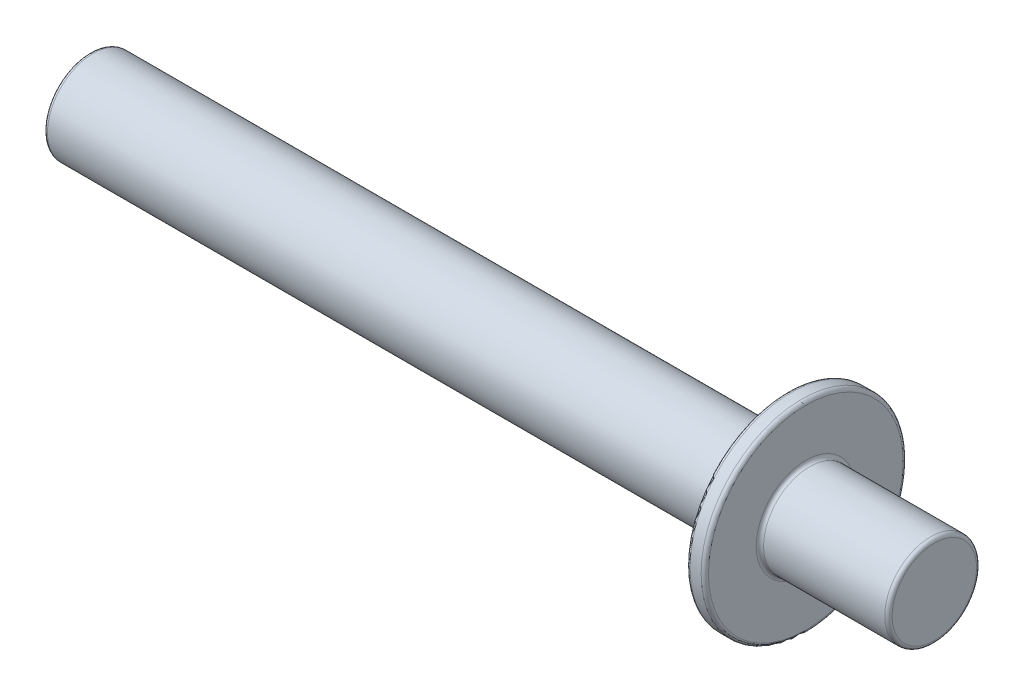
ISO-10303-21;
HEADER;
FILE_DESCRIPTION(('STEP AP214'),'2;1');
FILE_NAME('part.step','',(''),(''),'','','');
FILE_SCHEMA(('AUTOMOTIVE_DESIGN { 1 0 10303 214 1 1 1 1 }'));
ENDSEC;
DATA;
#1=APPLICATION_CONTEXT('core data for automotive mechanical design processes');
#2=APPLICATION_PROTOCOL_DEFINITION('international standard','automotive_design',2000,#1);
#3=PRODUCT_CONTEXT('',#1,'mechanical');
#4=PRODUCT('Part','Part','',(#3));
#5=PRODUCT_RELATED_PRODUCT_CATEGORY('part','',(#4));
#6=PRODUCT_DEFINITION_FORMATION('','',#4);
#7=PRODUCT_DEFINITION_CONTEXT('part definition',#1,'design');
#8=PRODUCT_DEFINITION('design','',#6,#7);
#9=PRODUCT_DEFINITION_SHAPE('','',#8);
#10=(LENGTH_UNIT() NAMED_UNIT(*) SI_UNIT(.MILLI.,.METRE.));
#11=(NAMED_UNIT(*) PLANE_ANGLE_UNIT() SI_UNIT($,.RADIAN.));
#12=(NAMED_UNIT(*) SI_UNIT($,.STERADIAN.) SOLID_ANGLE_UNIT());
#13=UNCERTAINTY_MEASURE_WITH_UNIT(LENGTH_MEASURE(1.E-05),#10,'distance_accuracy_value','');
#14=(GEOMETRIC_REPRESENTATION_CONTEXT(3) GLOBAL_UNCERTAINTY_ASSIGNED_CONTEXT((#13)) GLOBAL_UNIT_ASSIGNED_CONTEXT((#10,
#11,#12)) REPRESENTATION_CONTEXT('',''));
#15=CARTESIAN_POINT('',(0.,0.,0.));
#16=DIRECTION('',(0.,0.,1.));
#17=DIRECTION('',(1.,0.,0.));
#18=AXIS2_PLACEMENT_3D('',#15,#16,#17);
#19=CARTESIAN_POINT('',(-46.,0.,0.));
#20=DIRECTION('',(1.,0.,0.));
#21=DIRECTION('',(0.,0.,-1.));
#22=AXIS2_PLACEMENT_3D('',#19,#20,#21);
#23=PLANE('',#22);
#24=CARTESIAN_POINT('',(-46.,0.,0.));
#25=DIRECTION('',(1.,0.,0.));
#26=DIRECTION('',(0.,0.,-1.));
#27=AXIS2_PLACEMENT_3D('',#24,#25,#26);
#28=CIRCLE('',#27,2.3);
#29=CARTESIAN_POINT('',(-46.,0.,-2.3));
#30=VERTEX_POINT('',#29);
#31=EDGE_CURVE('E10',#30,#30,#28,.F.);
#32=ORIENTED_EDGE('',*,*,#31,.T.);
#33=EDGE_LOOP('',(#32));
#34=FACE_BOUND('',#33,.T.);
#35=ADVANCED_FACE('F31',(#34),#23,.F.);
#36=CARTESIAN_POINT('',(-86.0867088607595,0.,0.));
#37=DIRECTION('',(-1.,0.,0.));
#38=DIRECTION('',(0.,0.,1.));
#39=AXIS2_PLACEMENT_3D('',#36,#37,#38);
#40=CYLINDRICAL_SURFACE('',#39,2.5);
#41=CARTESIAN_POINT('',(-8.20000000000001,0.,0.));
#42=DIRECTION('',(1.,0.,0.));
#43=DIRECTION('',(0.,0.,-1.));
#44=AXIS2_PLACEMENT_3D('',#41,#42,#43);
#45=CIRCLE('',#44,2.5);
#46=CARTESIAN_POINT('',(-8.20000000000001,0.,-2.5));
#47=VERTEX_POINT('',#46);
#48=EDGE_CURVE('E37',#47,#47,#45,.F.);
#49=ORIENTED_EDGE('',*,*,#48,.T.);
#50=EDGE_LOOP('',(#49));
#51=FACE_BOUND('',#50,.T.);
#52=CARTESIAN_POINT('',(-45.8,0.,0.));
#53=DIRECTION('',(1.,0.,0.));
#54=DIRECTION('',(0.,0.,-1.));
#55=AXIS2_PLACEMENT_3D('',#52,#53,#54);
#56=CIRCLE('',#55,2.5);
#57=CARTESIAN_POINT('',(-45.8,0.,-2.5));
#58=VERTEX_POINT('',#57);
#59=EDGE_CURVE('E41',#58,#58,#56,.T.);
#60=ORIENTED_EDGE('',*,*,#59,.T.);
#61=EDGE_LOOP('',(#60));
#62=FACE_BOUND('',#61,.T.);
#63=ADVANCED_FACE('F88',(#51,#62),#40,.T.);
#64=CARTESIAN_POINT('',(-8.00000000000001,2.5,0.));
#65=DIRECTION('',(1.,0.,0.));
#66=DIRECTION('',(0.,0.,-1.));
#67=AXIS2_PLACEMENT_3D('',#64,#65,#66);
#68=PLANE('',#67);
#69=CARTESIAN_POINT('',(-8.00000000000001,0.,0.));
#70=DIRECTION('',(1.,0.,0.));
#71=DIRECTION('',(0.,0.,-1.));
#72=AXIS2_PLACEMENT_3D('',#69,#70,#71);
#73=CIRCLE('',#72,5.3);
#74=CARTESIAN_POINT('',(-8.00000000000001,0.,-5.3));
#75=VERTEX_POINT('',#74);
#76=EDGE_CURVE('E56',#75,#75,#73,.F.);
#77=ORIENTED_EDGE('',*,*,#76,.T.);
#78=EDGE_LOOP('',(#77));
#79=FACE_BOUND('',#78,.T.);
#80=CARTESIAN_POINT('',(-8.00000000000001,0.,0.));
#81=DIRECTION('',(1.,0.,0.));
#82=DIRECTION('',(0.,0.,-1.));
#83=AXIS2_PLACEMENT_3D('',#80,#81,#82);
#84=CIRCLE('',#83,2.7);
#85=CARTESIAN_POINT('',(-8.00000000000001,0.,-2.7));
#86=VERTEX_POINT('',#85);
#87=EDGE_CURVE('E59',#86,#86,#84,.T.);
#88=ORIENTED_EDGE('',*,*,#87,.T.);
#89=EDGE_LOOP('',(#88));
#90=FACE_BOUND('',#89,.T.);
#91=ADVANCED_FACE('F85',(#79,#90),#68,.F.);
#92=CARTESIAN_POINT('',(-86.0867088607595,0.,0.));
#93=DIRECTION('',(-1.,0.,0.));
#94=DIRECTION('',(0.,0.,1.));
#95=AXIS2_PLACEMENT_3D('',#92,#93,#94);
#96=CYLINDRICAL_SURFACE('',#95,5.5);
#97=CARTESIAN_POINT('',(-7.2,0.,0.));
#98=DIRECTION('',(-1.,0.,0.));
#99=DIRECTION('',(0.,0.,1.));
#100=AXIS2_PLACEMENT_3D('',#97,#98,#99);
#101=CIRCLE('',#100,5.5);
#102=CARTESIAN_POINT('',(-7.2,0.,5.5));
#103=VERTEX_POINT('',#102);
#104=EDGE_CURVE('E68',#103,#103,#101,.T.);
#105=ORIENTED_EDGE('',*,*,#104,.T.);
#106=EDGE_LOOP('',(#105));
#107=FACE_BOUND('',#106,.T.);
#108=CARTESIAN_POINT('',(-7.8,0.,0.));
#109=DIRECTION('',(1.,0.,0.));
#110=DIRECTION('',(0.,0.,-1.));
#111=AXIS2_PLACEMENT_3D('',#108,#109,#110);
#112=CIRCLE('',#111,5.5);
#113=CARTESIAN_POINT('',(-7.8,0.,-5.5));
#114=VERTEX_POINT('',#113);
#115=EDGE_CURVE('E71',#114,#114,#112,.T.);
#116=ORIENTED_EDGE('',*,*,#115,.T.);
#117=EDGE_LOOP('',(#116));
#118=FACE_BOUND('',#117,.T.);
#119=ADVANCED_FACE('F75',(#107,#118),#96,.T.);
#120=CARTESIAN_POINT('',(-7.,5.5,0.));
#121=DIRECTION('',(-1.,0.,0.));
#122=DIRECTION('',(0.,0.,1.));
#123=AXIS2_PLACEMENT_3D('',#120,#121,#122);
#124=PLANE('',#123);
#125=CARTESIAN_POINT('',(-7.,0.,0.));
#126=DIRECTION('',(-1.,0.,0.));
#127=DIRECTION('',(0.,0.,1.));
#128=AXIS2_PLACEMENT_3D('',#125,#126,#127);
#129=CIRCLE('',#128,5.3);
#130=CARTESIAN_POINT('',(-7.,0.,5.3));
#131=VERTEX_POINT('',#130);
#132=EDGE_CURVE('E62',#131,#131,#129,.F.);
#133=ORIENTED_EDGE('',*,*,#132,.T.);
#134=EDGE_LOOP('',(#133));
#135=FACE_BOUND('',#134,.T.);
#136=CARTESIAN_POINT('',(-7.,0.,0.));
#137=DIRECTION('',(-1.,0.,0.));
#138=DIRECTION('',(0.,0.,1.));
#139=AXIS2_PLACEMENT_3D('',#136,#137,#138);
#140=CIRCLE('',#139,2.7);
#141=CARTESIAN_POINT('',(-7.,0.,2.7));
#142=VERTEX_POINT('',#141);
#143=EDGE_CURVE('E65',#142,#142,#140,.T.);
#144=ORIENTED_EDGE('',*,*,#143,.T.);
#145=EDGE_LOOP('',(#144));
#146=FACE_BOUND('',#145,.T.);
#147=ADVANCED_FACE('F116',(#135,#146),#124,.F.);
#148=CARTESIAN_POINT('',(-86.0867088607595,0.,0.));
#149=DIRECTION('',(-1.,0.,0.));
#150=DIRECTION('',(0.,0.,1.));
#151=AXIS2_PLACEMENT_3D('',#148,#149,#150);
#152=CYLINDRICAL_SURFACE('',#151,2.5);
#153=CARTESIAN_POINT('',(-0.200000000000006,0.,0.));
#154=DIRECTION('',(-1.,0.,0.));
#155=DIRECTION('',(0.,0.,1.));
#156=AXIS2_PLACEMENT_3D('',#153,#154,#155);
#157=CIRCLE('',#156,2.5);
#158=CARTESIAN_POINT('',(-0.200000000000006,0.,2.5));
#159=VERTEX_POINT('',#158);
#160=EDGE_CURVE('E50',#159,#159,#157,.T.);
#161=ORIENTED_EDGE('',*,*,#160,.T.);
#162=EDGE_LOOP('',(#161));
#163=FACE_BOUND('',#162,.T.);
#164=CARTESIAN_POINT('',(-6.8,0.,0.));
#165=DIRECTION('',(-1.,0.,0.));
#166=DIRECTION('',(0.,0.,1.));
#167=AXIS2_PLACEMENT_3D('',#164,#165,#166);
#168=CIRCLE('',#167,2.5);
#169=CARTESIAN_POINT('',(-6.8,0.,2.5));
#170=VERTEX_POINT('',#169);
#171=EDGE_CURVE('E53',#170,#170,#168,.F.);
#172=ORIENTED_EDGE('',*,*,#171,.T.);
#173=EDGE_LOOP('',(#172));
#174=FACE_BOUND('',#173,.T.);
#175=ADVANCED_FACE('F120',(#163,#174),#152,.T.);
#176=CARTESIAN_POINT('',(0.,2.5,0.));
#177=DIRECTION('',(-1.,0.,0.));
#178=DIRECTION('',(0.,0.,1.));
#179=AXIS2_PLACEMENT_3D('',#176,#177,#178);
#180=PLANE('',#179);
#181=CARTESIAN_POINT('',(0.,0.,0.));
#182=DIRECTION('',(-1.,0.,0.));
#183=DIRECTION('',(0.,0.,1.));
#184=AXIS2_PLACEMENT_3D('',#181,#182,#183);
#185=CIRCLE('',#184,2.3);
#186=CARTESIAN_POINT('',(0.,0.,2.3));
#187=VERTEX_POINT('',#186);
#188=EDGE_CURVE('E45',#187,#187,#185,.F.);
#189=ORIENTED_EDGE('',*,*,#188,.T.);
#190=EDGE_LOOP('',(#189));
#191=FACE_BOUND('',#190,.T.);
#192=ADVANCED_FACE('F124',(#191),#180,.F.);
#193=CARTESIAN_POINT('',(-7.2,0.,0.));
#194=DIRECTION('',(-1.,0.,0.));
#195=DIRECTION('',(0.,0.,1.));
#196=AXIS2_PLACEMENT_3D('',#193,#194,#195);
#197=TOROIDAL_SURFACE('',#196,5.3,0.2);
#198=ORIENTED_EDGE('',*,*,#132,.F.);
#199=EDGE_LOOP('',(#198));
#200=FACE_BOUND('',#199,.T.);
#201=ORIENTED_EDGE('',*,*,#104,.F.);
#202=EDGE_LOOP('',(#201));
#203=FACE_BOUND('',#202,.T.);
#204=ADVANCED_FACE('F81',(#200,#203),#197,.T.);
#205=CARTESIAN_POINT('',(-7.8,0.,0.));
#206=DIRECTION('',(1.,0.,0.));
#207=DIRECTION('',(0.,0.,-1.));
#208=AXIS2_PLACEMENT_3D('',#205,#206,#207);
#209=TOROIDAL_SURFACE('',#208,5.3,0.2);
#210=ORIENTED_EDGE('',*,*,#115,.F.);
#211=EDGE_LOOP('',(#210));
#212=FACE_BOUND('',#211,.T.);
#213=ORIENTED_EDGE('',*,*,#76,.F.);
#214=EDGE_LOOP('',(#213));
#215=FACE_BOUND('',#214,.T.);
#216=ADVANCED_FACE('F77',(#212,#215),#209,.T.);
#217=CARTESIAN_POINT('',(-0.200000000000006,0.,0.));
#218=DIRECTION('',(-1.,0.,0.));
#219=DIRECTION('',(0.,0.,1.));
#220=AXIS2_PLACEMENT_3D('',#217,#218,#219);
#221=TOROIDAL_SURFACE('',#220,2.3,0.2);
#222=ORIENTED_EDGE('',*,*,#188,.F.);
#223=EDGE_LOOP('',(#222));
#224=FACE_BOUND('',#223,.T.);
#225=ORIENTED_EDGE('',*,*,#160,.F.);
#226=EDGE_LOOP('',(#225));
#227=FACE_BOUND('',#226,.T.);
#228=ADVANCED_FACE('F80',(#224,#227),#221,.T.);
#229=CARTESIAN_POINT('',(-6.8,0.,0.));
#230=DIRECTION('',(-1.,0.,0.));
#231=DIRECTION('',(0.,0.,1.));
#232=AXIS2_PLACEMENT_3D('',#229,#230,#231);
#233=TOROIDAL_SURFACE('',#232,2.7,0.2);
#234=ORIENTED_EDGE('',*,*,#171,.F.);
#235=EDGE_LOOP('',(#234));
#236=FACE_BOUND('',#235,.T.);
#237=ORIENTED_EDGE('',*,*,#143,.F.);
#238=EDGE_LOOP('',(#237));
#239=FACE_BOUND('',#238,.T.);
#240=ADVANCED_FACE('F96',(#236,#239),#233,.F.);
#241=CARTESIAN_POINT('',(-8.20000000000001,0.,0.));
#242=DIRECTION('',(1.,0.,0.));
#243=DIRECTION('',(0.,0.,-1.));
#244=AXIS2_PLACEMENT_3D('',#241,#242,#243);
#245=TOROIDAL_SURFACE('',#244,2.7,0.2);
#246=ORIENTED_EDGE('',*,*,#87,.F.);
#247=EDGE_LOOP('',(#246));
#248=FACE_BOUND('',#247,.T.);
#249=ORIENTED_EDGE('',*,*,#48,.F.);
#250=EDGE_LOOP('',(#249));
#251=FACE_BOUND('',#250,.T.);
#252=ADVANCED_FACE('F92',(#248,#251),#245,.F.);
#253=CARTESIAN_POINT('',(-45.8,0.,0.));
#254=DIRECTION('',(1.,0.,0.));
#255=DIRECTION('',(0.,0.,-1.));
#256=AXIS2_PLACEMENT_3D('',#253,#254,#255);
#257=TOROIDAL_SURFACE('',#256,2.3,0.2);
#258=ORIENTED_EDGE('',*,*,#59,.F.);
#259=EDGE_LOOP('',(#258));
#260=FACE_BOUND('',#259,.T.);
#261=ORIENTED_EDGE('',*,*,#31,.F.);
#262=EDGE_LOOP('',(#261));
#263=FACE_BOUND('',#262,.T.);
#264=ADVANCED_FACE('F95',(#260,#263),#257,.T.);
#265=CLOSED_SHELL('',(#35,#63,#91,#119,#147,#175,#192,#204,#216,#228,#240,#252,#264));
#266=MANIFOLD_SOLID_BREP('B2',#265);
#267=ADVANCED_BREP_SHAPE_REPRESENTATION('',(#18,#266),#14);
#268=SHAPE_DEFINITION_REPRESENTATION(#9,#267);
ENDSEC;
END-ISO-10303-21;
